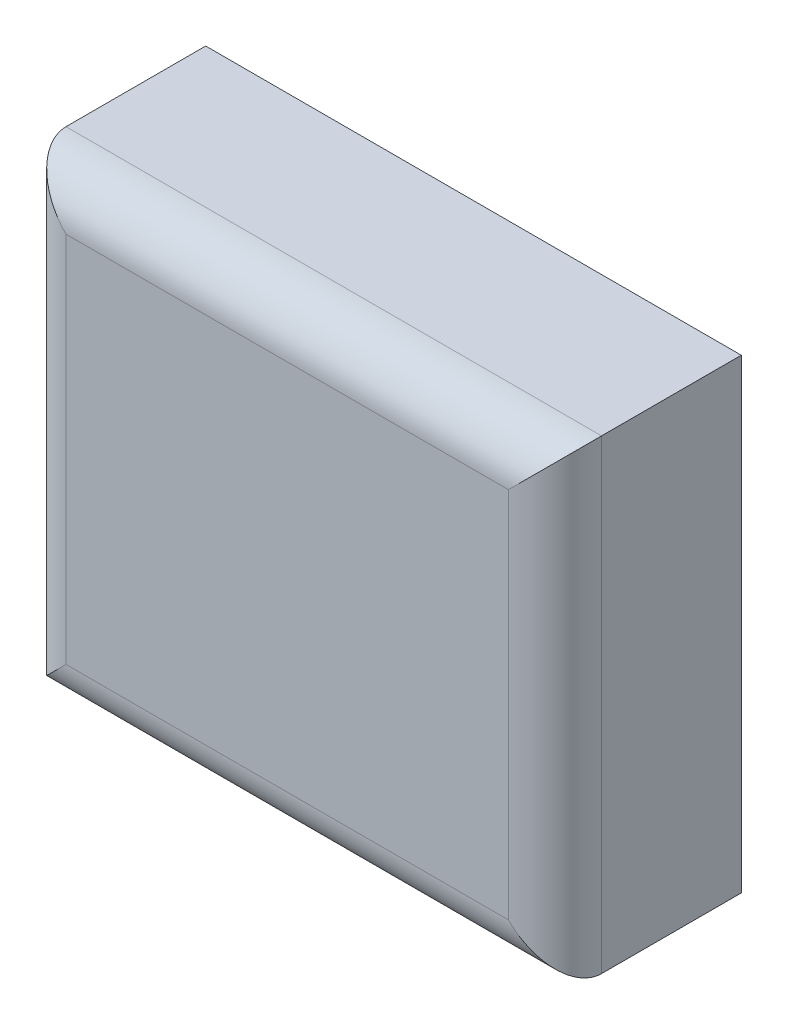
ISO-10303-21;
HEADER;
FILE_DESCRIPTION(('STEP AP214'),'2;1');
FILE_NAME('part.step','',(''),(''),'','','');
FILE_SCHEMA(('AUTOMOTIVE_DESIGN { 1 0 10303 214 1 1 1 1 }'));
ENDSEC;
DATA;
#1=APPLICATION_CONTEXT('core data for automotive mechanical design processes');
#2=APPLICATION_PROTOCOL_DEFINITION('international standard','automotive_design',2000,#1);
#3=PRODUCT_CONTEXT('',#1,'mechanical');
#4=PRODUCT('Part','Part','',(#3));
#5=PRODUCT_RELATED_PRODUCT_CATEGORY('part','',(#4));
#6=PRODUCT_DEFINITION_FORMATION('','',#4);
#7=PRODUCT_DEFINITION_CONTEXT('part definition',#1,'design');
#8=PRODUCT_DEFINITION('design','',#6,#7);
#9=PRODUCT_DEFINITION_SHAPE('','',#8);
#10=(LENGTH_UNIT() NAMED_UNIT(*) SI_UNIT(.MILLI.,.METRE.));
#11=(NAMED_UNIT(*) PLANE_ANGLE_UNIT() SI_UNIT($,.RADIAN.));
#12=(NAMED_UNIT(*) SI_UNIT($,.STERADIAN.) SOLID_ANGLE_UNIT());
#13=UNCERTAINTY_MEASURE_WITH_UNIT(LENGTH_MEASURE(1.E-05),#10,'distance_accuracy_value','');
#14=(GEOMETRIC_REPRESENTATION_CONTEXT(3) GLOBAL_UNCERTAINTY_ASSIGNED_CONTEXT((#13)) GLOBAL_UNIT_ASSIGNED_CONTEXT((#10,
#11,#12)) REPRESENTATION_CONTEXT('',''));
#15=CARTESIAN_POINT('',(0.,0.,0.));
#16=DIRECTION('',(0.,0.,1.));
#17=DIRECTION('',(1.,0.,0.));
#18=AXIS2_PLACEMENT_3D('',#15,#16,#17);
#19=CARTESIAN_POINT('',(-5.75,5.,4.));
#20=DIRECTION('',(1.,0.,0.));
#21=DIRECTION('',(0.,0.,-1.));
#22=AXIS2_PLACEMENT_3D('',#19,#20,#21);
#23=PLANE('',#22);
#24=DIRECTION('',(0.,0.,-1.));
#25=VECTOR('',#24,1.);
#26=CARTESIAN_POINT('',(-5.75,-5.,4.));
#27=LINE('',#26,#25);
#28=CARTESIAN_POINT('',(-5.75,-5.,3.));
#29=VERTEX_POINT('',#28);
#30=CARTESIAN_POINT('',(-5.75,-5.,0.));
#31=VERTEX_POINT('',#30);
#32=EDGE_CURVE('E89',#29,#31,#27,.T.);
#33=ORIENTED_EDGE('',*,*,#32,.F.);
#34=DIRECTION('',(0.,-1.,0.));
#35=VECTOR('',#34,1.);
#36=CARTESIAN_POINT('',(-5.75,5.,3.));
#37=LINE('',#36,#35);
#38=CARTESIAN_POINT('',(-5.75,5.,3.));
#39=VERTEX_POINT('',#38);
#40=EDGE_CURVE('E46',#29,#39,#37,.F.);
#41=ORIENTED_EDGE('',*,*,#40,.T.);
#42=DIRECTION('',(0.,0.,-1.));
#43=VECTOR('',#42,1.);
#44=CARTESIAN_POINT('',(-5.75,5.,4.));
#45=LINE('',#44,#43);
#46=CARTESIAN_POINT('',(-5.75,5.,0.));
#47=VERTEX_POINT('',#46);
#48=EDGE_CURVE('E109',#39,#47,#45,.T.);
#49=ORIENTED_EDGE('',*,*,#48,.T.);
#50=DIRECTION('',(0.,-1.,0.));
#51=VECTOR('',#50,1.);
#52=CARTESIAN_POINT('',(-5.75,5.,0.));
#53=LINE('',#52,#51);
#54=EDGE_CURVE('E104',#47,#31,#53,.T.);
#55=ORIENTED_EDGE('',*,*,#54,.T.);
#56=EDGE_LOOP('',(#33,#41,#49,#55));
#57=FACE_BOUND('',#56,.T.);
#58=ADVANCED_FACE('F37',(#57),#23,.F.);
#59=CARTESIAN_POINT('',(-5.75,-5.,4.));
#60=DIRECTION('',(0.,1.,0.));
#61=DIRECTION('',(-1.,0.,0.));
#62=AXIS2_PLACEMENT_3D('',#59,#60,#61);
#63=PLANE('',#62);
#64=DIRECTION('',(0.,0.,-1.));
#65=VECTOR('',#64,1.);
#66=CARTESIAN_POINT('',(5.75,-5.,4.));
#67=LINE('',#66,#65);
#68=CARTESIAN_POINT('',(5.75,-5.,3.));
#69=VERTEX_POINT('',#68);
#70=CARTESIAN_POINT('',(5.75,-5.,0.));
#71=VERTEX_POINT('',#70);
#72=EDGE_CURVE('E98',#69,#71,#67,.T.);
#73=ORIENTED_EDGE('',*,*,#72,.F.);
#74=DIRECTION('',(1.,0.,0.));
#75=VECTOR('',#74,1.);
#76=CARTESIAN_POINT('',(-5.75,-5.,3.));
#77=LINE('',#76,#75);
#78=EDGE_CURVE('E11',#69,#29,#77,.F.);
#79=ORIENTED_EDGE('',*,*,#78,.T.);
#80=ORIENTED_EDGE('',*,*,#32,.T.);
#81=DIRECTION('',(1.,0.,0.));
#82=VECTOR('',#81,1.);
#83=CARTESIAN_POINT('',(-5.75,-5.,0.));
#84=LINE('',#83,#82);
#85=EDGE_CURVE('E92',#31,#71,#84,.T.);
#86=ORIENTED_EDGE('',*,*,#85,.T.);
#87=EDGE_LOOP('',(#73,#79,#80,#86));
#88=FACE_BOUND('',#87,.T.);
#89=ADVANCED_FACE('F91',(#88),#63,.F.);
#90=CARTESIAN_POINT('',(5.75,5.,4.));
#91=DIRECTION('',(-1.,0.,0.));
#92=DIRECTION('',(0.,-1.,0.));
#93=AXIS2_PLACEMENT_3D('',#90,#91,#92);
#94=PLANE('',#93);
#95=DIRECTION('',(0.,0.,-1.));
#96=VECTOR('',#95,1.);
#97=CARTESIAN_POINT('',(5.75,5.,4.));
#98=LINE('',#97,#96);
#99=CARTESIAN_POINT('',(5.75,5.,3.));
#100=VERTEX_POINT('',#99);
#101=CARTESIAN_POINT('',(5.75,5.,0.));
#102=VERTEX_POINT('',#101);
#103=EDGE_CURVE('E119',#100,#102,#98,.T.);
#104=ORIENTED_EDGE('',*,*,#103,.F.);
#105=DIRECTION('',(0.,1.,0.));
#106=VECTOR('',#105,1.);
#107=CARTESIAN_POINT('',(5.75,-5.,3.));
#108=LINE('',#107,#106);
#109=EDGE_CURVE('E60',#100,#69,#108,.F.);
#110=ORIENTED_EDGE('',*,*,#109,.T.);
#111=ORIENTED_EDGE('',*,*,#72,.T.);
#112=DIRECTION('',(0.,1.,0.));
#113=VECTOR('',#112,1.);
#114=CARTESIAN_POINT('',(5.75,5.,0.));
#115=LINE('',#114,#113);
#116=EDGE_CURVE('E106',#71,#102,#115,.T.);
#117=ORIENTED_EDGE('',*,*,#116,.T.);
#118=EDGE_LOOP('',(#104,#110,#111,#117));
#119=FACE_BOUND('',#118,.T.);
#120=ADVANCED_FACE('F157',(#119),#94,.F.);
#121=CARTESIAN_POINT('',(-5.75,5.,4.));
#122=DIRECTION('',(0.,-1.,0.));
#123=DIRECTION('',(1.,0.,0.));
#124=AXIS2_PLACEMENT_3D('',#121,#122,#123);
#125=PLANE('',#124);
#126=ORIENTED_EDGE('',*,*,#48,.F.);
#127=DIRECTION('',(-1.,0.,0.));
#128=VECTOR('',#127,1.);
#129=CARTESIAN_POINT('',(5.75,5.,3.));
#130=LINE('',#129,#128);
#131=EDGE_CURVE('E130',#39,#100,#130,.F.);
#132=ORIENTED_EDGE('',*,*,#131,.T.);
#133=ORIENTED_EDGE('',*,*,#103,.T.);
#134=DIRECTION('',(-1.,0.,0.));
#135=VECTOR('',#134,1.);
#136=CARTESIAN_POINT('',(-5.75,5.,0.));
#137=LINE('',#136,#135);
#138=EDGE_CURVE('E116',#102,#47,#137,.T.);
#139=ORIENTED_EDGE('',*,*,#138,.T.);
#140=EDGE_LOOP('',(#126,#132,#133,#139));
#141=FACE_BOUND('',#140,.T.);
#142=ADVANCED_FACE('F156',(#141),#125,.F.);
#143=CARTESIAN_POINT('',(0.,0.,4.));
#144=DIRECTION('',(0.,0.,1.));
#145=DIRECTION('',(1.,0.,0.));
#146=AXIS2_PLACEMENT_3D('',#143,#144,#145);
#147=PLANE('',#146);
#148=DIRECTION('',(0.,1.,0.));
#149=VECTOR('',#148,1.);
#150=CARTESIAN_POINT('',(4.75,5.,4.));
#151=LINE('',#150,#149);
#152=CARTESIAN_POINT('',(4.75,-4.,4.));
#153=VERTEX_POINT('',#152);
#154=CARTESIAN_POINT('',(4.75,4.,4.));
#155=VERTEX_POINT('',#154);
#156=EDGE_CURVE('E125',#153,#155,#151,.T.);
#157=ORIENTED_EDGE('',*,*,#156,.T.);
#158=DIRECTION('',(-1.,0.,0.));
#159=VECTOR('',#158,1.);
#160=CARTESIAN_POINT('',(-5.75,4.,4.));
#161=LINE('',#160,#159);
#162=CARTESIAN_POINT('',(-4.75,4.,4.));
#163=VERTEX_POINT('',#162);
#164=EDGE_CURVE('E127',#155,#163,#161,.T.);
#165=ORIENTED_EDGE('',*,*,#164,.T.);
#166=DIRECTION('',(0.,-1.,0.));
#167=VECTOR('',#166,1.);
#168=CARTESIAN_POINT('',(-4.75,-5.,4.));
#169=LINE('',#168,#167);
#170=CARTESIAN_POINT('',(-4.75,-4.,4.));
#171=VERTEX_POINT('',#170);
#172=EDGE_CURVE('E123',#163,#171,#169,.T.);
#173=ORIENTED_EDGE('',*,*,#172,.T.);
#174=DIRECTION('',(1.,0.,0.));
#175=VECTOR('',#174,1.);
#176=CARTESIAN_POINT('',(5.75,-4.,4.));
#177=LINE('',#176,#175);
#178=EDGE_CURVE('E97',#171,#153,#177,.T.);
#179=ORIENTED_EDGE('',*,*,#178,.T.);
#180=EDGE_LOOP('',(#157,#165,#173,#179));
#181=FACE_BOUND('',#180,.T.);
#182=ADVANCED_FACE('F149',(#181),#147,.T.);
#183=CARTESIAN_POINT('',(0.,0.,0.));
#184=DIRECTION('',(0.,0.,1.));
#185=DIRECTION('',(1.,0.,0.));
#186=AXIS2_PLACEMENT_3D('',#183,#184,#185);
#187=PLANE('',#186);
#188=ORIENTED_EDGE('',*,*,#54,.F.);
#189=ORIENTED_EDGE('',*,*,#138,.F.);
#190=ORIENTED_EDGE('',*,*,#116,.F.);
#191=ORIENTED_EDGE('',*,*,#85,.F.);
#192=EDGE_LOOP('',(#188,#189,#190,#191));
#193=FACE_BOUND('',#192,.T.);
#194=ADVANCED_FACE('F102',(#193),#187,.F.);
#195=CARTESIAN_POINT('',(0.,-4.,3.));
#196=DIRECTION('',(-1.,0.,0.));
#197=DIRECTION('',(0.,-1.,0.));
#198=AXIS2_PLACEMENT_3D('',#195,#196,#197);
#199=CYLINDRICAL_SURFACE('',#198,1.);
#200=CARTESIAN_POINT('',(-4.75,-4.,3.));
#201=DIRECTION('',(-0.707106781186548,0.707106781186547,0.));
#202=DIRECTION('',(-0.707106781186547,-0.707106781186548,0.));
#203=AXIS2_PLACEMENT_3D('',#200,#201,#202);
#204=ELLIPSE('',#203,1.4142135623731,1.);
#205=EDGE_CURVE('E113',#29,#171,#204,.T.);
#206=ORIENTED_EDGE('',*,*,#205,.F.);
#207=ORIENTED_EDGE('',*,*,#78,.F.);
#208=CARTESIAN_POINT('',(4.75,-4.,3.));
#209=DIRECTION('',(-0.707106781186547,-0.707106781186548,0.));
#210=DIRECTION('',(-0.707106781186548,0.707106781186547,0.));
#211=AXIS2_PLACEMENT_3D('',#208,#209,#210);
#212=ELLIPSE('',#211,1.4142135623731,1.);
#213=EDGE_CURVE('E41',#153,#69,#212,.F.);
#214=ORIENTED_EDGE('',*,*,#213,.F.);
#215=ORIENTED_EDGE('',*,*,#178,.F.);
#216=EDGE_LOOP('',(#206,#207,#214,#215));
#217=FACE_BOUND('',#216,.T.);
#218=ADVANCED_FACE('F39',(#217),#199,.T.);
#219=CARTESIAN_POINT('',(4.75,0.,3.));
#220=DIRECTION('',(0.,-1.,0.));
#221=DIRECTION('',(1.,0.,0.));
#222=AXIS2_PLACEMENT_3D('',#219,#220,#221);
#223=CYLINDRICAL_SURFACE('',#222,1.);
#224=ORIENTED_EDGE('',*,*,#213,.T.);
#225=ORIENTED_EDGE('',*,*,#109,.F.);
#226=CARTESIAN_POINT('',(4.75,4.,3.));
#227=DIRECTION('',(0.707106781186548,-0.707106781186547,0.));
#228=DIRECTION('',(-0.707106781186547,-0.707106781186548,0.));
#229=AXIS2_PLACEMENT_3D('',#226,#227,#228);
#230=ELLIPSE('',#229,1.41421356237309,1.);
#231=EDGE_CURVE('E137',#155,#100,#230,.F.);
#232=ORIENTED_EDGE('',*,*,#231,.F.);
#233=ORIENTED_EDGE('',*,*,#156,.F.);
#234=EDGE_LOOP('',(#224,#225,#232,#233));
#235=FACE_BOUND('',#234,.T.);
#236=ADVANCED_FACE('F174',(#235),#223,.T.);
#237=CARTESIAN_POINT('',(-4.75,0.,3.));
#238=DIRECTION('',(0.,1.,0.));
#239=DIRECTION('',(0.,0.,1.));
#240=AXIS2_PLACEMENT_3D('',#237,#238,#239);
#241=CYLINDRICAL_SURFACE('',#240,1.);
#242=ORIENTED_EDGE('',*,*,#205,.T.);
#243=ORIENTED_EDGE('',*,*,#172,.F.);
#244=CARTESIAN_POINT('',(-4.75,4.,3.));
#245=DIRECTION('',(0.707106781186547,0.707106781186548,0.));
#246=DIRECTION('',(-0.707106781186548,0.707106781186547,0.));
#247=AXIS2_PLACEMENT_3D('',#244,#245,#246);
#248=ELLIPSE('',#247,1.41421356237309,1.);
#249=EDGE_CURVE('E135',#39,#163,#248,.T.);
#250=ORIENTED_EDGE('',*,*,#249,.F.);
#251=ORIENTED_EDGE('',*,*,#40,.F.);
#252=EDGE_LOOP('',(#242,#243,#250,#251));
#253=FACE_BOUND('',#252,.T.);
#254=ADVANCED_FACE('F142',(#253),#241,.T.);
#255=CARTESIAN_POINT('',(0.,4.,3.));
#256=DIRECTION('',(1.,0.,0.));
#257=DIRECTION('',(0.,1.,0.));
#258=AXIS2_PLACEMENT_3D('',#255,#256,#257);
#259=CYLINDRICAL_SURFACE('',#258,1.);
#260=ORIENTED_EDGE('',*,*,#231,.T.);
#261=ORIENTED_EDGE('',*,*,#131,.F.);
#262=ORIENTED_EDGE('',*,*,#249,.T.);
#263=ORIENTED_EDGE('',*,*,#164,.F.);
#264=EDGE_LOOP('',(#260,#261,#262,#263));
#265=FACE_BOUND('',#264,.T.);
#266=ADVANCED_FACE('F153',(#265),#259,.T.);
#267=CLOSED_SHELL('',(#58,#89,#120,#142,#182,#194,#218,#236,#254,#266));
#268=MANIFOLD_SOLID_BREP('B2',#267);
#269=ADVANCED_BREP_SHAPE_REPRESENTATION('',(#18,#268),#14);
#270=SHAPE_DEFINITION_REPRESENTATION(#9,#269);
ENDSEC;
END-ISO-10303-21;
